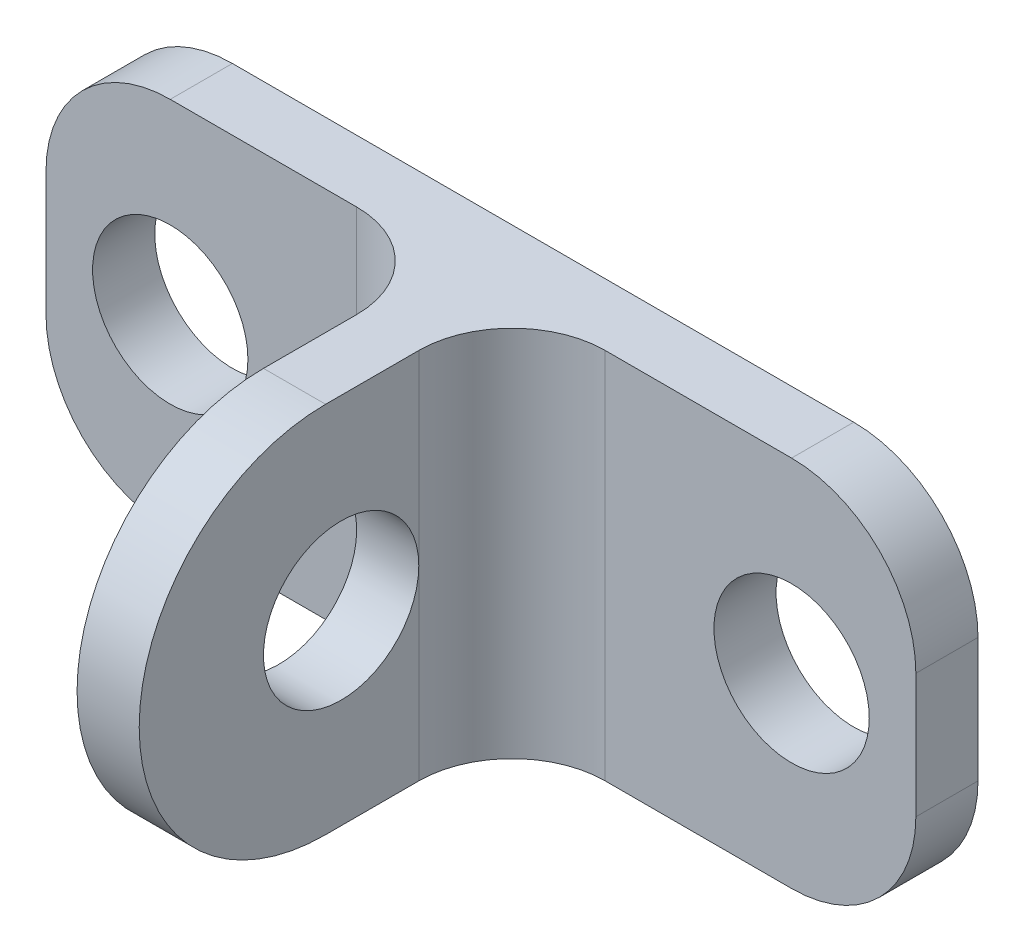
ISO-10303-21;
HEADER;
FILE_DESCRIPTION(('STEP AP214'),'2;1');
FILE_NAME('part.step','',(''),(''),'','','');
FILE_SCHEMA(('AUTOMOTIVE_DESIGN { 1 0 10303 214 1 1 1 1 }'));
ENDSEC;
DATA;
#1=APPLICATION_CONTEXT('core data for automotive mechanical design processes');
#2=APPLICATION_PROTOCOL_DEFINITION('international standard','automotive_design',2000,#1);
#3=PRODUCT_CONTEXT('',#1,'mechanical');
#4=PRODUCT('Part','Part','',(#3));
#5=PRODUCT_RELATED_PRODUCT_CATEGORY('part','',(#4));
#6=PRODUCT_DEFINITION_FORMATION('','',#4);
#7=PRODUCT_DEFINITION_CONTEXT('part definition',#1,'design');
#8=PRODUCT_DEFINITION('design','',#6,#7);
#9=PRODUCT_DEFINITION_SHAPE('','',#8);
#10=(LENGTH_UNIT() NAMED_UNIT(*) SI_UNIT(.MILLI.,.METRE.));
#11=(NAMED_UNIT(*) PLANE_ANGLE_UNIT() SI_UNIT($,.RADIAN.));
#12=(NAMED_UNIT(*) SI_UNIT($,.STERADIAN.) SOLID_ANGLE_UNIT());
#13=UNCERTAINTY_MEASURE_WITH_UNIT(LENGTH_MEASURE(1.E-05),#10,'distance_accuracy_value','');
#14=(GEOMETRIC_REPRESENTATION_CONTEXT(3) GLOBAL_UNCERTAINTY_ASSIGNED_CONTEXT((#13)) GLOBAL_UNIT_ASSIGNED_CONTEXT((#10,
#11,#12)) REPRESENTATION_CONTEXT('',''));
#15=CARTESIAN_POINT('',(0.,0.,0.));
#16=DIRECTION('',(0.,0.,1.));
#17=DIRECTION('',(1.,0.,0.));
#18=AXIS2_PLACEMENT_3D('',#15,#16,#17);
#19=CARTESIAN_POINT('',(-0.5,0.,4.00000000000001));
#20=DIRECTION('',(-1.,0.,0.));
#21=DIRECTION('',(0.,0.,1.));
#22=AXIS2_PLACEMENT_3D('',#19,#20,#21);
#23=CYLINDRICAL_SURFACE('',#22,2.99999999999999);
#24=DIRECTION('',(1.,0.,0.));
#25=VECTOR('',#24,1.);
#26=CARTESIAN_POINT('',(-0.500000000000001,3.,4.00000000000001));
#27=LINE('',#26,#25);
#28=CARTESIAN_POINT('',(-0.5,3.,4.00000000000001));
#29=VERTEX_POINT('',#28);
#30=CARTESIAN_POINT('',(0.5,3.,4.00000000000001));
#31=VERTEX_POINT('',#30);
#32=EDGE_CURVE('E153',#29,#31,#27,.T.);
#33=ORIENTED_EDGE('',*,*,#32,.F.);
#34=CARTESIAN_POINT('',(-0.5,0.,4.00000000000001));
#35=DIRECTION('',(1.,0.,0.));
#36=DIRECTION('',(0.,0.,-1.));
#37=AXIS2_PLACEMENT_3D('',#34,#35,#36);
#38=CIRCLE('',#37,2.99999999999999);
#39=CARTESIAN_POINT('',(-0.5,-2.99999999999998,4.00000000000001));
#40=VERTEX_POINT('',#39);
#41=EDGE_CURVE('E237',#40,#29,#38,.F.);
#42=ORIENTED_EDGE('',*,*,#41,.F.);
#43=DIRECTION('',(-1.,0.,0.));
#44=VECTOR('',#43,1.);
#45=CARTESIAN_POINT('',(0.,-2.99999999999998,4.00000000000001));
#46=LINE('',#45,#44);
#47=CARTESIAN_POINT('',(0.5,-2.99999999999998,4.00000000000001));
#48=VERTEX_POINT('',#47);
#49=EDGE_CURVE('E239',#48,#40,#46,.T.);
#50=ORIENTED_EDGE('',*,*,#49,.F.);
#51=CARTESIAN_POINT('',(0.5,0.,4.00000000000001));
#52=DIRECTION('',(-1.,0.,0.));
#53=DIRECTION('',(0.,0.,1.));
#54=AXIS2_PLACEMENT_3D('',#51,#52,#53);
#55=CIRCLE('',#54,2.99999999999999);
#56=EDGE_CURVE('E226',#31,#48,#55,.F.);
#57=ORIENTED_EDGE('',*,*,#56,.F.);
#58=EDGE_LOOP('',(#33,#42,#50,#57));
#59=FACE_BOUND('',#58,.T.);
#60=ADVANCED_FACE('F35',(#59),#23,.T.);
#61=CARTESIAN_POINT('',(0.,0.,1.));
#62=DIRECTION('',(0.,0.,1.));
#63=DIRECTION('',(1.,0.,0.));
#64=AXIS2_PLACEMENT_3D('',#61,#62,#63);
#65=PLANE('',#64);
#66=DIRECTION('',(1.,0.,0.));
#67=VECTOR('',#66,1.);
#68=CARTESIAN_POINT('',(0.,3.,1.));
#69=LINE('',#68,#67);
#70=CARTESIAN_POINT('',(2.,3.,1.));
#71=VERTEX_POINT('',#70);
#72=CARTESIAN_POINT('',(5.,3.,1.));
#73=VERTEX_POINT('',#72);
#74=EDGE_CURVE('E187',#71,#73,#69,.T.);
#75=ORIENTED_EDGE('',*,*,#74,.F.);
#76=DIRECTION('',(0.,1.,0.));
#77=VECTOR('',#76,1.);
#78=CARTESIAN_POINT('',(2.,0.,1.));
#79=LINE('',#78,#77);
#80=CARTESIAN_POINT('',(2.,-2.99999999999998,1.));
#81=VERTEX_POINT('',#80);
#82=EDGE_CURVE('E197',#71,#81,#79,.F.);
#83=ORIENTED_EDGE('',*,*,#82,.T.);
#84=DIRECTION('',(1.,0.,0.));
#85=VECTOR('',#84,1.);
#86=CARTESIAN_POINT('',(0.,-2.99999999999998,1.));
#87=LINE('',#86,#85);
#88=CARTESIAN_POINT('',(5.,-2.99999999999998,1.));
#89=VERTEX_POINT('',#88);
#90=EDGE_CURVE('E168',#81,#89,#87,.T.);
#91=ORIENTED_EDGE('',*,*,#90,.T.);
#92=CARTESIAN_POINT('',(5.,-0.999999999999999,1.));
#93=DIRECTION('',(0.,0.,1.));
#94=DIRECTION('',(1.,0.,0.));
#95=AXIS2_PLACEMENT_3D('',#92,#93,#94);
#96=CIRCLE('',#95,1.99999999999999);
#97=CARTESIAN_POINT('',(7.00000000000001,-0.999999999999999,1.));
#98=VERTEX_POINT('',#97);
#99=EDGE_CURVE('E174',#98,#89,#96,.F.);
#100=ORIENTED_EDGE('',*,*,#99,.F.);
#101=DIRECTION('',(0.,1.,0.));
#102=VECTOR('',#101,1.);
#103=CARTESIAN_POINT('',(7.00000000000001,0.,1.));
#104=LINE('',#103,#102);
#105=CARTESIAN_POINT('',(7.00000000000001,1.00000000000002,1.));
#106=VERTEX_POINT('',#105);
#107=EDGE_CURVE('E496',#98,#106,#104,.T.);
#108=ORIENTED_EDGE('',*,*,#107,.T.);
#109=CARTESIAN_POINT('',(5.,1.00000000000002,1.));
#110=DIRECTION('',(0.,0.,1.));
#111=DIRECTION('',(1.,0.,0.));
#112=AXIS2_PLACEMENT_3D('',#109,#110,#111);
#113=CIRCLE('',#112,1.99999999999999);
#114=EDGE_CURVE('E193',#73,#106,#113,.F.);
#115=ORIENTED_EDGE('',*,*,#114,.F.);
#116=EDGE_LOOP('',(#75,#83,#91,#100,#108,#115));
#117=FACE_BOUND('',#116,.T.);
#118=CARTESIAN_POINT('',(5.,0.,1.));
#119=DIRECTION('',(0.,0.,1.));
#120=DIRECTION('',(1.,0.,0.));
#121=AXIS2_PLACEMENT_3D('',#118,#119,#120);
#122=CIRCLE('',#121,1.24999999999981);
#123=CARTESIAN_POINT('',(6.24999999999981,0.,1.));
#124=VERTEX_POINT('',#123);
#125=EDGE_CURVE('E186',#124,#124,#122,.T.);
#126=ORIENTED_EDGE('',*,*,#125,.F.);
#127=EDGE_LOOP('',(#126));
#128=FACE_BOUND('',#127,.T.);
#129=ADVANCED_FACE('F331',(#117,#128),#65,.T.);
#130=CARTESIAN_POINT('',(-5.,1.00000000000002,1.));
#131=DIRECTION('',(0.,0.,-1.));
#132=DIRECTION('',(-1.,0.,0.));
#133=AXIS2_PLACEMENT_3D('',#130,#131,#132);
#134=CYLINDRICAL_SURFACE('',#133,1.99999999999999);
#135=CARTESIAN_POINT('',(-5.,1.00000000000002,0.));
#136=DIRECTION('',(0.,0.,1.));
#137=DIRECTION('',(1.,0.,0.));
#138=AXIS2_PLACEMENT_3D('',#135,#136,#137);
#139=CIRCLE('',#138,1.99999999999999);
#140=CARTESIAN_POINT('',(-7.00000000000001,1.00000000000002,0.));
#141=VERTEX_POINT('',#140);
#142=CARTESIAN_POINT('',(-5.,3.,0.));
#143=VERTEX_POINT('',#142);
#144=EDGE_CURVE('E148',#141,#143,#139,.F.);
#145=ORIENTED_EDGE('',*,*,#144,.F.);
#146=DIRECTION('',(0.,0.,-1.));
#147=VECTOR('',#146,1.);
#148=CARTESIAN_POINT('',(-7.00000000000001,1.00000000000002,1.));
#149=LINE('',#148,#147);
#150=CARTESIAN_POINT('',(-7.00000000000001,1.00000000000002,1.));
#151=VERTEX_POINT('',#150);
#152=EDGE_CURVE('E143',#151,#141,#149,.T.);
#153=ORIENTED_EDGE('',*,*,#152,.F.);
#154=CARTESIAN_POINT('',(-5.,1.00000000000002,1.));
#155=DIRECTION('',(0.,0.,1.));
#156=DIRECTION('',(1.,0.,0.));
#157=AXIS2_PLACEMENT_3D('',#154,#155,#156);
#158=CIRCLE('',#157,1.99999999999999);
#159=CARTESIAN_POINT('',(-5.,3.,1.));
#160=VERTEX_POINT('',#159);
#161=EDGE_CURVE('E146',#151,#160,#158,.F.);
#162=ORIENTED_EDGE('',*,*,#161,.T.);
#163=DIRECTION('',(0.,0.,-1.));
#164=VECTOR('',#163,1.);
#165=CARTESIAN_POINT('',(-5.,3.,1.));
#166=LINE('',#165,#164);
#167=EDGE_CURVE('E271',#160,#143,#166,.T.);
#168=ORIENTED_EDGE('',*,*,#167,.T.);
#169=EDGE_LOOP('',(#145,#153,#162,#168));
#170=FACE_BOUND('',#169,.T.);
#171=ADVANCED_FACE('F145',(#170),#134,.T.);
#172=CARTESIAN_POINT('',(-7.00000000000001,0.,1.));
#173=DIRECTION('',(-1.,0.,0.));
#174=DIRECTION('',(0.,0.,1.));
#175=AXIS2_PLACEMENT_3D('',#172,#173,#174);
#176=PLANE('',#175);
#177=DIRECTION('',(0.,1.,0.));
#178=VECTOR('',#177,1.);
#179=CARTESIAN_POINT('',(-7.00000000000001,0.,0.));
#180=LINE('',#179,#178);
#181=CARTESIAN_POINT('',(-7.00000000000001,-1.,0.));
#182=VERTEX_POINT('',#181);
#183=EDGE_CURVE('E294',#182,#141,#180,.T.);
#184=ORIENTED_EDGE('',*,*,#183,.F.);
#185=DIRECTION('',(0.,0.,-1.));
#186=VECTOR('',#185,1.);
#187=CARTESIAN_POINT('',(-7.00000000000001,-1.,1.));
#188=LINE('',#187,#186);
#189=CARTESIAN_POINT('',(-7.00000000000001,-1.,1.));
#190=VERTEX_POINT('',#189);
#191=EDGE_CURVE('E154',#190,#182,#188,.T.);
#192=ORIENTED_EDGE('',*,*,#191,.F.);
#193=DIRECTION('',(0.,1.,0.));
#194=VECTOR('',#193,1.);
#195=CARTESIAN_POINT('',(-7.00000000000001,0.,1.));
#196=LINE('',#195,#194);
#197=EDGE_CURVE('E160',#190,#151,#196,.T.);
#198=ORIENTED_EDGE('',*,*,#197,.T.);
#199=ORIENTED_EDGE('',*,*,#152,.T.);
#200=EDGE_LOOP('',(#184,#192,#198,#199));
#201=FACE_BOUND('',#200,.T.);
#202=ADVANCED_FACE('F165',(#201),#176,.T.);
#203=CARTESIAN_POINT('',(-5.,-1.,1.));
#204=DIRECTION('',(0.,0.,-1.));
#205=DIRECTION('',(-1.,0.,0.));
#206=AXIS2_PLACEMENT_3D('',#203,#204,#205);
#207=CYLINDRICAL_SURFACE('',#206,1.99999999999999);
#208=CARTESIAN_POINT('',(-5.,-1.,0.));
#209=DIRECTION('',(0.,0.,1.));
#210=DIRECTION('',(1.,0.,0.));
#211=AXIS2_PLACEMENT_3D('',#208,#209,#210);
#212=CIRCLE('',#211,1.99999999999999);
#213=CARTESIAN_POINT('',(-5.,-2.99999999999998,0.));
#214=VERTEX_POINT('',#213);
#215=EDGE_CURVE('E293',#214,#182,#212,.F.);
#216=ORIENTED_EDGE('',*,*,#215,.F.);
#217=DIRECTION('',(0.,0.,-1.));
#218=VECTOR('',#217,1.);
#219=CARTESIAN_POINT('',(-5.,-2.99999999999998,1.));
#220=LINE('',#219,#218);
#221=CARTESIAN_POINT('',(-5.,-2.99999999999998,1.));
#222=VERTEX_POINT('',#221);
#223=EDGE_CURVE('E288',#222,#214,#220,.T.);
#224=ORIENTED_EDGE('',*,*,#223,.F.);
#225=CARTESIAN_POINT('',(-5.,-1.,1.));
#226=DIRECTION('',(0.,0.,1.));
#227=DIRECTION('',(1.,0.,0.));
#228=AXIS2_PLACEMENT_3D('',#225,#226,#227);
#229=CIRCLE('',#228,1.99999999999999);
#230=EDGE_CURVE('E166',#222,#190,#229,.F.);
#231=ORIENTED_EDGE('',*,*,#230,.T.);
#232=ORIENTED_EDGE('',*,*,#191,.T.);
#233=EDGE_LOOP('',(#216,#224,#231,#232));
#234=FACE_BOUND('',#233,.T.);
#235=ADVANCED_FACE('F291',(#234),#207,.T.);
#236=CARTESIAN_POINT('',(0.,-2.99999999999998,1.));
#237=DIRECTION('',(0.,1.,0.));
#238=DIRECTION('',(-1.,0.,0.));
#239=AXIS2_PLACEMENT_3D('',#236,#237,#238);
#240=PLANE('',#239);
#241=DIRECTION('',(0.,0.,-1.));
#242=VECTOR('',#241,1.);
#243=CARTESIAN_POINT('',(0.5,-2.99999999999998,7.));
#244=LINE('',#243,#242);
#245=CARTESIAN_POINT('',(0.5,-2.99999999999998,2.5));
#246=VERTEX_POINT('',#245);
#247=EDGE_CURVE('E215',#48,#246,#244,.T.);
#248=ORIENTED_EDGE('',*,*,#247,.F.);
#249=ORIENTED_EDGE('',*,*,#49,.T.);
#250=DIRECTION('',(0.,0.,-1.));
#251=VECTOR('',#250,1.);
#252=CARTESIAN_POINT('',(-0.5,-2.99999999999998,7.));
#253=LINE('',#252,#251);
#254=CARTESIAN_POINT('',(-0.5,-2.99999999999998,2.5));
#255=VERTEX_POINT('',#254);
#256=EDGE_CURVE('E228',#40,#255,#253,.T.);
#257=ORIENTED_EDGE('',*,*,#256,.T.);
#258=CARTESIAN_POINT('',(-2.,-2.99999999999998,2.5));
#259=DIRECTION('',(0.,1.,0.));
#260=DIRECTION('',(-1.,0.,0.));
#261=AXIS2_PLACEMENT_3D('',#258,#259,#260);
#262=CIRCLE('',#261,1.5);
#263=CARTESIAN_POINT('',(-2.,-2.99999999999998,1.));
#264=VERTEX_POINT('',#263);
#265=EDGE_CURVE('E43',#255,#264,#262,.T.);
#266=ORIENTED_EDGE('',*,*,#265,.T.);
#267=EDGE_CURVE('E181',#222,#264,#87,.T.);
#268=ORIENTED_EDGE('',*,*,#267,.F.);
#269=ORIENTED_EDGE('',*,*,#223,.T.);
#270=DIRECTION('',(1.,0.,0.));
#271=VECTOR('',#270,1.);
#272=CARTESIAN_POINT('',(0.,-2.99999999999998,0.));
#273=LINE('',#272,#271);
#274=CARTESIAN_POINT('',(5.,-2.99999999999998,0.));
#275=VERTEX_POINT('',#274);
#276=EDGE_CURVE('E302',#214,#275,#273,.T.);
#277=ORIENTED_EDGE('',*,*,#276,.T.);
#278=DIRECTION('',(0.,0.,-1.));
#279=VECTOR('',#278,1.);
#280=CARTESIAN_POINT('',(5.,-2.99999999999998,1.));
#281=LINE('',#280,#279);
#282=EDGE_CURVE('E286',#89,#275,#281,.T.);
#283=ORIENTED_EDGE('',*,*,#282,.F.);
#284=ORIENTED_EDGE('',*,*,#90,.F.);
#285=CARTESIAN_POINT('',(2.,-2.99999999999998,2.5));
#286=DIRECTION('',(0.,1.,0.));
#287=DIRECTION('',(-1.,0.,0.));
#288=AXIS2_PLACEMENT_3D('',#285,#286,#287);
#289=CIRCLE('',#288,1.5);
#290=EDGE_CURVE('E208',#81,#246,#289,.T.);
#291=ORIENTED_EDGE('',*,*,#290,.T.);
#292=EDGE_LOOP('',(#248,#249,#257,#266,#268,#269,#277,#283,#284,#291));
#293=FACE_BOUND('',#292,.T.);
#294=ADVANCED_FACE('F213',(#293),#240,.F.);
#295=CARTESIAN_POINT('',(5.,-0.999999999999999,1.));
#296=DIRECTION('',(0.,0.,-1.));
#297=DIRECTION('',(-1.,0.,0.));
#298=AXIS2_PLACEMENT_3D('',#295,#296,#297);
#299=CYLINDRICAL_SURFACE('',#298,1.99999999999999);
#300=CARTESIAN_POINT('',(5.,-0.999999999999999,0.));
#301=DIRECTION('',(0.,0.,1.));
#302=DIRECTION('',(1.,0.,0.));
#303=AXIS2_PLACEMENT_3D('',#300,#301,#302);
#304=CIRCLE('',#303,1.99999999999999);
#305=CARTESIAN_POINT('',(7.00000000000001,-0.999999999999999,0.));
#306=VERTEX_POINT('',#305);
#307=EDGE_CURVE('E304',#306,#275,#304,.F.);
#308=ORIENTED_EDGE('',*,*,#307,.F.);
#309=DIRECTION('',(0.,0.,-1.));
#310=VECTOR('',#309,1.);
#311=CARTESIAN_POINT('',(7.00000000000001,-0.999999999999999,1.));
#312=LINE('',#311,#310);
#313=EDGE_CURVE('E284',#98,#306,#312,.T.);
#314=ORIENTED_EDGE('',*,*,#313,.F.);
#315=ORIENTED_EDGE('',*,*,#99,.T.);
#316=ORIENTED_EDGE('',*,*,#282,.T.);
#317=EDGE_LOOP('',(#308,#314,#315,#316));
#318=FACE_BOUND('',#317,.T.);
#319=ADVANCED_FACE('F405',(#318),#299,.T.);
#320=CARTESIAN_POINT('',(7.00000000000001,0.,1.));
#321=DIRECTION('',(-1.,0.,0.));
#322=DIRECTION('',(0.,0.,1.));
#323=AXIS2_PLACEMENT_3D('',#320,#321,#322);
#324=PLANE('',#323);
#325=DIRECTION('',(0.,1.,0.));
#326=VECTOR('',#325,1.);
#327=CARTESIAN_POINT('',(7.00000000000001,0.,0.));
#328=LINE('',#327,#326);
#329=CARTESIAN_POINT('',(7.00000000000001,1.00000000000002,0.));
#330=VERTEX_POINT('',#329);
#331=EDGE_CURVE('E309',#306,#330,#328,.T.);
#332=ORIENTED_EDGE('',*,*,#331,.T.);
#333=DIRECTION('',(0.,0.,-1.));
#334=VECTOR('',#333,1.);
#335=CARTESIAN_POINT('',(7.00000000000001,1.00000000000002,1.));
#336=LINE('',#335,#334);
#337=EDGE_CURVE('E277',#106,#330,#336,.T.);
#338=ORIENTED_EDGE('',*,*,#337,.F.);
#339=ORIENTED_EDGE('',*,*,#107,.F.);
#340=ORIENTED_EDGE('',*,*,#313,.T.);
#341=EDGE_LOOP('',(#332,#338,#339,#340));
#342=FACE_BOUND('',#341,.T.);
#343=ADVANCED_FACE('F445',(#342),#324,.F.);
#344=CARTESIAN_POINT('',(5.,1.00000000000002,1.));
#345=DIRECTION('',(0.,0.,-1.));
#346=DIRECTION('',(-1.,0.,0.));
#347=AXIS2_PLACEMENT_3D('',#344,#345,#346);
#348=CYLINDRICAL_SURFACE('',#347,1.99999999999999);
#349=CARTESIAN_POINT('',(5.,1.00000000000002,0.));
#350=DIRECTION('',(0.,0.,1.));
#351=DIRECTION('',(1.,0.,0.));
#352=AXIS2_PLACEMENT_3D('',#349,#350,#351);
#353=CIRCLE('',#352,1.99999999999999);
#354=CARTESIAN_POINT('',(5.,3.,0.));
#355=VERTEX_POINT('',#354);
#356=EDGE_CURVE('E312',#355,#330,#353,.F.);
#357=ORIENTED_EDGE('',*,*,#356,.F.);
#358=DIRECTION('',(0.,0.,-1.));
#359=VECTOR('',#358,1.);
#360=CARTESIAN_POINT('',(5.,3.,1.));
#361=LINE('',#360,#359);
#362=EDGE_CURVE('E274',#73,#355,#361,.T.);
#363=ORIENTED_EDGE('',*,*,#362,.F.);
#364=ORIENTED_EDGE('',*,*,#114,.T.);
#365=ORIENTED_EDGE('',*,*,#337,.T.);
#366=EDGE_LOOP('',(#357,#363,#364,#365));
#367=FACE_BOUND('',#366,.T.);
#368=ADVANCED_FACE('F437',(#367),#348,.T.);
#369=CARTESIAN_POINT('',(5.,0.,1.));
#370=DIRECTION('',(0.,0.,-1.));
#371=DIRECTION('',(-1.,0.,0.));
#372=AXIS2_PLACEMENT_3D('',#369,#370,#371);
#373=CYLINDRICAL_SURFACE('',#372,1.24999999999981);
#374=ORIENTED_EDGE('',*,*,#125,.T.);
#375=EDGE_LOOP('',(#374));
#376=FACE_BOUND('',#375,.T.);
#377=CARTESIAN_POINT('',(5.,0.,0.));
#378=DIRECTION('',(0.,0.,1.));
#379=DIRECTION('',(1.,0.,0.));
#380=AXIS2_PLACEMENT_3D('',#377,#378,#379);
#381=CIRCLE('',#380,1.24999999999981);
#382=CARTESIAN_POINT('',(6.24999999999981,0.,0.));
#383=VERTEX_POINT('',#382);
#384=EDGE_CURVE('E315',#383,#383,#381,.T.);
#385=ORIENTED_EDGE('',*,*,#384,.F.);
#386=EDGE_LOOP('',(#385));
#387=FACE_BOUND('',#386,.T.);
#388=ADVANCED_FACE('F332',(#376,#387),#373,.F.);
#389=CARTESIAN_POINT('',(0.,3.,1.));
#390=DIRECTION('',(0.,1.,0.));
#391=DIRECTION('',(-1.,0.,0.));
#392=AXIS2_PLACEMENT_3D('',#389,#390,#391);
#393=PLANE('',#392);
#394=DIRECTION('',(0.,0.,-1.));
#395=VECTOR('',#394,1.);
#396=CARTESIAN_POINT('',(-0.5,3.,7.));
#397=LINE('',#396,#395);
#398=CARTESIAN_POINT('',(-0.5,3.,2.5));
#399=VERTEX_POINT('',#398);
#400=EDGE_CURVE('E241',#29,#399,#397,.T.);
#401=ORIENTED_EDGE('',*,*,#400,.F.);
#402=ORIENTED_EDGE('',*,*,#32,.T.);
#403=DIRECTION('',(0.,0.,-1.));
#404=VECTOR('',#403,1.);
#405=CARTESIAN_POINT('',(0.5,3.,7.));
#406=LINE('',#405,#404);
#407=CARTESIAN_POINT('',(0.5,3.,2.5));
#408=VERTEX_POINT('',#407);
#409=EDGE_CURVE('E229',#31,#408,#406,.T.);
#410=ORIENTED_EDGE('',*,*,#409,.T.);
#411=CARTESIAN_POINT('',(2.,3.,2.5));
#412=DIRECTION('',(0.,1.,0.));
#413=DIRECTION('',(-1.,0.,0.));
#414=AXIS2_PLACEMENT_3D('',#411,#412,#413);
#415=CIRCLE('',#414,1.5);
#416=EDGE_CURVE('E206',#408,#71,#415,.F.);
#417=ORIENTED_EDGE('',*,*,#416,.T.);
#418=ORIENTED_EDGE('',*,*,#74,.T.);
#419=ORIENTED_EDGE('',*,*,#362,.T.);
#420=DIRECTION('',(1.,0.,0.));
#421=VECTOR('',#420,1.);
#422=CARTESIAN_POINT('',(0.,3.,0.));
#423=LINE('',#422,#421);
#424=EDGE_CURVE('E273',#143,#355,#423,.T.);
#425=ORIENTED_EDGE('',*,*,#424,.F.);
#426=ORIENTED_EDGE('',*,*,#167,.F.);
#427=CARTESIAN_POINT('',(-2.,3.,1.));
#428=VERTEX_POINT('',#427);
#429=EDGE_CURVE('E162',#160,#428,#69,.T.);
#430=ORIENTED_EDGE('',*,*,#429,.T.);
#431=CARTESIAN_POINT('',(-2.,3.,2.5));
#432=DIRECTION('',(0.,1.,0.));
#433=DIRECTION('',(-1.,0.,0.));
#434=AXIS2_PLACEMENT_3D('',#431,#432,#433);
#435=CIRCLE('',#434,1.5);
#436=EDGE_CURVE('E11',#428,#399,#435,.F.);
#437=ORIENTED_EDGE('',*,*,#436,.T.);
#438=EDGE_LOOP('',(#401,#402,#410,#417,#418,#419,#425,#426,#430,#437));
#439=FACE_BOUND('',#438,.T.);
#440=ADVANCED_FACE('F269',(#439),#393,.T.);
#441=CARTESIAN_POINT('',(-5.,0.,1.));
#442=DIRECTION('',(0.,0.,-1.));
#443=DIRECTION('',(-1.,0.,0.));
#444=AXIS2_PLACEMENT_3D('',#441,#442,#443);
#445=CYLINDRICAL_SURFACE('',#444,1.24999999999982);
#446=CARTESIAN_POINT('',(-5.,0.,1.));
#447=DIRECTION('',(0.,0.,1.));
#448=DIRECTION('',(1.,0.,0.));
#449=AXIS2_PLACEMENT_3D('',#446,#447,#448);
#450=CIRCLE('',#449,1.24999999999982);
#451=CARTESIAN_POINT('',(-3.75000000000018,0.,1.));
#452=VERTEX_POINT('',#451);
#453=EDGE_CURVE('E275',#452,#452,#450,.T.);
#454=ORIENTED_EDGE('',*,*,#453,.T.);
#455=EDGE_LOOP('',(#454));
#456=FACE_BOUND('',#455,.T.);
#457=CARTESIAN_POINT('',(-5.,0.,0.));
#458=DIRECTION('',(0.,0.,1.));
#459=DIRECTION('',(1.,0.,0.));
#460=AXIS2_PLACEMENT_3D('',#457,#458,#459);
#461=CIRCLE('',#460,1.24999999999982);
#462=CARTESIAN_POINT('',(-3.75000000000018,0.,0.));
#463=VERTEX_POINT('',#462);
#464=EDGE_CURVE('E163',#463,#463,#461,.T.);
#465=ORIENTED_EDGE('',*,*,#464,.F.);
#466=EDGE_LOOP('',(#465));
#467=FACE_BOUND('',#466,.T.);
#468=ADVANCED_FACE('F322',(#456,#467),#445,.F.);
#469=ORIENTED_EDGE('',*,*,#267,.T.);
#470=DIRECTION('',(0.,-1.,0.));
#471=VECTOR('',#470,1.);
#472=CARTESIAN_POINT('',(-2.,0.,1.));
#473=LINE('',#472,#471);
#474=EDGE_CURVE('E56',#264,#428,#473,.F.);
#475=ORIENTED_EDGE('',*,*,#474,.T.);
#476=ORIENTED_EDGE('',*,*,#429,.F.);
#477=ORIENTED_EDGE('',*,*,#161,.F.);
#478=ORIENTED_EDGE('',*,*,#197,.F.);
#479=ORIENTED_EDGE('',*,*,#230,.F.);
#480=EDGE_LOOP('',(#469,#475,#476,#477,#478,#479));
#481=FACE_BOUND('',#480,.T.);
#482=ORIENTED_EDGE('',*,*,#453,.F.);
#483=EDGE_LOOP('',(#482));
#484=FACE_BOUND('',#483,.T.);
#485=ADVANCED_FACE('F157',(#481,#484),#65,.T.);
#486=CARTESIAN_POINT('',(0.,0.,0.));
#487=DIRECTION('',(0.,0.,1.));
#488=DIRECTION('',(1.,0.,0.));
#489=AXIS2_PLACEMENT_3D('',#486,#487,#488);
#490=PLANE('',#489);
#491=ORIENTED_EDGE('',*,*,#144,.T.);
#492=ORIENTED_EDGE('',*,*,#424,.T.);
#493=ORIENTED_EDGE('',*,*,#356,.T.);
#494=ORIENTED_EDGE('',*,*,#331,.F.);
#495=ORIENTED_EDGE('',*,*,#307,.T.);
#496=ORIENTED_EDGE('',*,*,#276,.F.);
#497=ORIENTED_EDGE('',*,*,#215,.T.);
#498=ORIENTED_EDGE('',*,*,#183,.T.);
#499=EDGE_LOOP('',(#491,#492,#493,#494,#495,#496,#497,#498));
#500=FACE_BOUND('',#499,.T.);
#501=ORIENTED_EDGE('',*,*,#384,.T.);
#502=EDGE_LOOP('',(#501));
#503=FACE_BOUND('',#502,.T.);
#504=ORIENTED_EDGE('',*,*,#464,.T.);
#505=EDGE_LOOP('',(#504));
#506=FACE_BOUND('',#505,.T.);
#507=ADVANCED_FACE('F298',(#500,#503,#506),#490,.F.);
#508=CARTESIAN_POINT('',(-0.5,3.,7.));
#509=DIRECTION('',(1.,0.,0.));
#510=DIRECTION('',(0.,0.,-1.));
#511=AXIS2_PLACEMENT_3D('',#508,#509,#510);
#512=PLANE('',#511);
#513=ORIENTED_EDGE('',*,*,#400,.T.);
#514=DIRECTION('',(0.,-1.,0.));
#515=VECTOR('',#514,1.);
#516=CARTESIAN_POINT('',(-0.5,3.,2.5));
#517=LINE('',#516,#515);
#518=CARTESIAN_POINT('',(-0.5,0.,2.5));
#519=VERTEX_POINT('',#518);
#520=EDGE_CURVE('E202',#399,#519,#517,.T.);
#521=ORIENTED_EDGE('',*,*,#520,.T.);
#522=CARTESIAN_POINT('',(-0.5,0.,3.75));
#523=DIRECTION('',(-1.,0.,0.));
#524=DIRECTION('',(0.,0.,1.));
#525=AXIS2_PLACEMENT_3D('',#522,#523,#524);
#526=CIRCLE('',#525,1.25);
#527=EDGE_CURVE('E255',#519,#519,#526,.T.);
#528=ORIENTED_EDGE('',*,*,#527,.F.);
#529=DIRECTION('',(0.,-1.,0.));
#530=VECTOR('',#529,1.);
#531=CARTESIAN_POINT('',(-0.5,3.,2.5));
#532=LINE('',#531,#530);
#533=EDGE_CURVE('E199',#519,#255,#532,.T.);
#534=ORIENTED_EDGE('',*,*,#533,.T.);
#535=ORIENTED_EDGE('',*,*,#256,.F.);
#536=ORIENTED_EDGE('',*,*,#41,.T.);
#537=EDGE_LOOP('',(#513,#521,#528,#534,#535,#536));
#538=FACE_BOUND('',#537,.T.);
#539=ADVANCED_FACE('F263',(#538),#512,.F.);
#540=CARTESIAN_POINT('',(0.5,3.,7.));
#541=DIRECTION('',(-1.,0.,0.));
#542=DIRECTION('',(0.,0.,1.));
#543=AXIS2_PLACEMENT_3D('',#540,#541,#542);
#544=PLANE('',#543);
#545=ORIENTED_EDGE('',*,*,#247,.T.);
#546=DIRECTION('',(0.,1.,0.));
#547=VECTOR('',#546,1.);
#548=CARTESIAN_POINT('',(0.5,3.,2.5));
#549=LINE('',#548,#547);
#550=CARTESIAN_POINT('',(0.5,0.,2.5));
#551=VERTEX_POINT('',#550);
#552=EDGE_CURVE('E200',#246,#551,#549,.T.);
#553=ORIENTED_EDGE('',*,*,#552,.T.);
#554=CARTESIAN_POINT('',(0.5,0.,3.75));
#555=DIRECTION('',(-1.,0.,0.));
#556=DIRECTION('',(0.,0.,1.));
#557=AXIS2_PLACEMENT_3D('',#554,#555,#556);
#558=CIRCLE('',#557,1.25);
#559=EDGE_CURVE('E252',#551,#551,#558,.F.);
#560=ORIENTED_EDGE('',*,*,#559,.F.);
#561=DIRECTION('',(0.,1.,0.));
#562=VECTOR('',#561,1.);
#563=CARTESIAN_POINT('',(0.5,3.,2.5));
#564=LINE('',#563,#562);
#565=EDGE_CURVE('E233',#551,#408,#564,.T.);
#566=ORIENTED_EDGE('',*,*,#565,.T.);
#567=ORIENTED_EDGE('',*,*,#409,.F.);
#568=ORIENTED_EDGE('',*,*,#56,.T.);
#569=EDGE_LOOP('',(#545,#553,#560,#566,#567,#568));
#570=FACE_BOUND('',#569,.T.);
#571=ADVANCED_FACE('F222',(#570),#544,.F.);
#572=CARTESIAN_POINT('',(7.00100000000001,0.,3.75));
#573=DIRECTION('',(-1.,0.,0.));
#574=DIRECTION('',(0.,0.,1.));
#575=AXIS2_PLACEMENT_3D('',#572,#573,#574);
#576=CYLINDRICAL_SURFACE('',#575,1.25);
#577=ORIENTED_EDGE('',*,*,#527,.T.);
#578=EDGE_LOOP('',(#577));
#579=FACE_BOUND('',#578,.T.);
#580=ORIENTED_EDGE('',*,*,#559,.T.);
#581=EDGE_LOOP('',(#580));
#582=FACE_BOUND('',#581,.T.);
#583=ADVANCED_FACE('F261',(#579,#582),#576,.F.);
#584=CARTESIAN_POINT('',(2.,3.,2.5));
#585=DIRECTION('',(0.,1.,0.));
#586=DIRECTION('',(0.,0.,1.));
#587=AXIS2_PLACEMENT_3D('',#584,#585,#586);
#588=CYLINDRICAL_SURFACE('',#587,1.5);
#589=ORIENTED_EDGE('',*,*,#290,.F.);
#590=ORIENTED_EDGE('',*,*,#82,.F.);
#591=ORIENTED_EDGE('',*,*,#416,.F.);
#592=ORIENTED_EDGE('',*,*,#565,.F.);
#593=ORIENTED_EDGE('',*,*,#552,.F.);
#594=EDGE_LOOP('',(#589,#590,#591,#592,#593));
#595=FACE_BOUND('',#594,.T.);
#596=ADVANCED_FACE('F231',(#595),#588,.F.);
#597=CARTESIAN_POINT('',(-2.,3.,2.5));
#598=DIRECTION('',(0.,-1.,0.));
#599=DIRECTION('',(0.,0.,-1.));
#600=AXIS2_PLACEMENT_3D('',#597,#598,#599);
#601=CYLINDRICAL_SURFACE('',#600,1.5);
#602=ORIENTED_EDGE('',*,*,#436,.F.);
#603=ORIENTED_EDGE('',*,*,#474,.F.);
#604=ORIENTED_EDGE('',*,*,#265,.F.);
#605=ORIENTED_EDGE('',*,*,#533,.F.);
#606=ORIENTED_EDGE('',*,*,#520,.F.);
#607=EDGE_LOOP('',(#602,#603,#604,#605,#606));
#608=FACE_BOUND('',#607,.T.);
#609=ADVANCED_FACE('F37',(#608),#601,.F.);
#610=CLOSED_SHELL('',(#60,#129,#171,#202,#235,#294,#319,#343,#368,#388,#440,#468,#485,#507,#539,
#571,#583,#596,#609));
#611=MANIFOLD_SOLID_BREP('B2',#610);
#612=ADVANCED_BREP_SHAPE_REPRESENTATION('',(#18,#611),#14);
#613=SHAPE_DEFINITION_REPRESENTATION(#9,#612);
ENDSEC;
END-ISO-10303-21;
